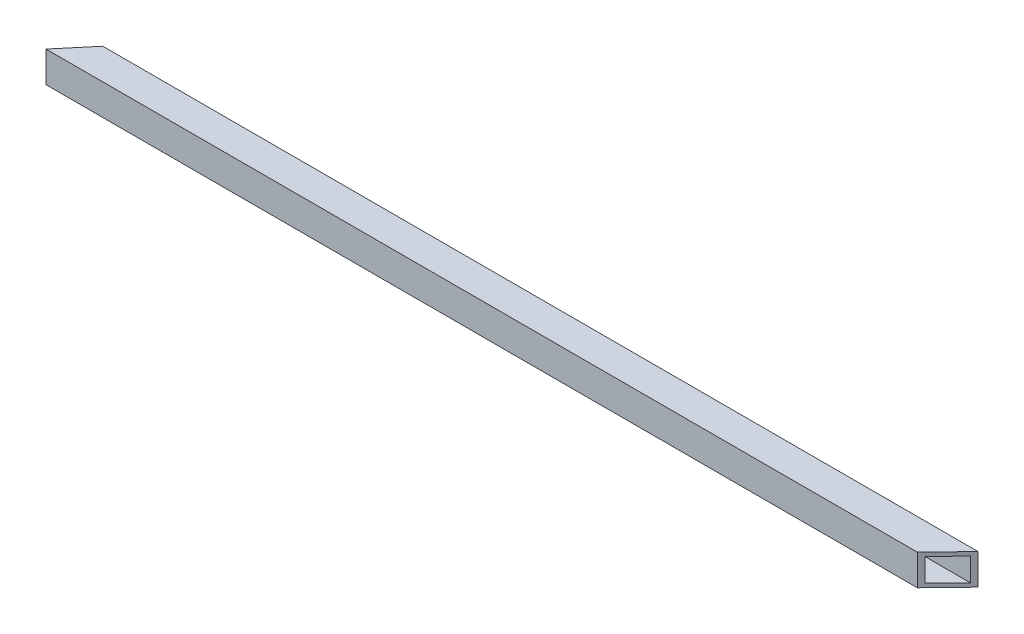
ISO-10303-21;
HEADER;
FILE_DESCRIPTION(('STEP AP214'),'2;1');
FILE_NAME('part.step','',(''),(''),'','','');
FILE_SCHEMA(('AUTOMOTIVE_DESIGN { 1 0 10303 214 1 1 1 1 }'));
ENDSEC;
DATA;
#1=APPLICATION_CONTEXT('core data for automotive mechanical design processes');
#2=APPLICATION_PROTOCOL_DEFINITION('international standard','automotive_design',2000,#1);
#3=PRODUCT_CONTEXT('',#1,'mechanical');
#4=PRODUCT('Part','Part','',(#3));
#5=PRODUCT_RELATED_PRODUCT_CATEGORY('part','',(#4));
#6=PRODUCT_DEFINITION_FORMATION('','',#4);
#7=PRODUCT_DEFINITION_CONTEXT('part definition',#1,'design');
#8=PRODUCT_DEFINITION('design','',#6,#7);
#9=PRODUCT_DEFINITION_SHAPE('','',#8);
#10=(LENGTH_UNIT() NAMED_UNIT(*) SI_UNIT(.MILLI.,.METRE.));
#11=(NAMED_UNIT(*) PLANE_ANGLE_UNIT() SI_UNIT($,.RADIAN.));
#12=(NAMED_UNIT(*) SI_UNIT($,.STERADIAN.) SOLID_ANGLE_UNIT());
#13=UNCERTAINTY_MEASURE_WITH_UNIT(LENGTH_MEASURE(1.E-05),#10,'distance_accuracy_value','');
#14=(GEOMETRIC_REPRESENTATION_CONTEXT(3) GLOBAL_UNCERTAINTY_ASSIGNED_CONTEXT((#13)) GLOBAL_UNIT_ASSIGNED_CONTEXT((#10,
#11,#12)) REPRESENTATION_CONTEXT('',''));
#15=CARTESIAN_POINT('',(0.,0.,0.));
#16=DIRECTION('',(0.,0.,1.));
#17=DIRECTION('',(1.,0.,0.));
#18=AXIS2_PLACEMENT_3D('',#15,#16,#17);
#19=CARTESIAN_POINT('',(185.42,6.35,6.35));
#20=DIRECTION('',(0.,0.,-1.));
#21=DIRECTION('',(0.,1.,0.));
#22=AXIS2_PLACEMENT_3D('',#19,#20,#21);
#23=PLANE('',#22);
#24=DIRECTION('',(-1.,0.,0.));
#25=VECTOR('',#24,1.);
#26=CARTESIAN_POINT('',(185.42,-6.35,6.35));
#27=LINE('',#26,#25);
#28=CARTESIAN_POINT('',(173.1509388256,-6.35,6.35));
#29=VERTEX_POINT('',#28);
#30=CARTESIAN_POINT('',(-185.42,-6.35,6.35));
#31=VERTEX_POINT('',#30);
#32=EDGE_CURVE('E114',#29,#31,#27,.T.);
#33=ORIENTED_EDGE('',*,*,#32,.F.);
#34=DIRECTION('',(0.,1.,0.));
#35=VECTOR('',#34,1.);
#36=CARTESIAN_POINT('',(173.1509388256,-6.35,6.35));
#37=LINE('',#36,#35);
#38=CARTESIAN_POINT('',(173.1509388256,6.35,6.35));
#39=VERTEX_POINT('',#38);
#40=EDGE_CURVE('E99',#29,#39,#37,.T.);
#41=ORIENTED_EDGE('',*,*,#40,.T.);
#42=DIRECTION('',(-1.,0.,0.));
#43=VECTOR('',#42,1.);
#44=CARTESIAN_POINT('',(185.42,6.35,6.35));
#45=LINE('',#44,#43);
#46=CARTESIAN_POINT('',(-185.42,6.35,6.35));
#47=VERTEX_POINT('',#46);
#48=EDGE_CURVE('E112',#39,#47,#45,.T.);
#49=ORIENTED_EDGE('',*,*,#48,.T.);
#50=DIRECTION('',(0.,-1.,0.));
#51=VECTOR('',#50,1.);
#52=CARTESIAN_POINT('',(-185.42,6.35,6.35));
#53=LINE('',#52,#51);
#54=EDGE_CURVE('E124',#47,#31,#53,.T.);
#55=ORIENTED_EDGE('',*,*,#54,.T.);
#56=EDGE_LOOP('',(#33,#41,#49,#55));
#57=FACE_BOUND('',#56,.T.);
#58=ADVANCED_FACE('F32',(#57),#23,.F.);
#59=CARTESIAN_POINT('',(185.42,-6.35,-6.35));
#60=DIRECTION('',(0.,1.,0.));
#61=DIRECTION('',(0.,0.,1.));
#62=AXIS2_PLACEMENT_3D('',#59,#60,#61);
#63=PLANE('',#62);
#64=DIRECTION('',(-1.,0.,0.));
#65=VECTOR('',#64,1.);
#66=CARTESIAN_POINT('',(185.42,-6.35,-6.35));
#67=LINE('',#66,#65);
#68=CARTESIAN_POINT('',(185.42,-6.35,-6.35));
#69=VERTEX_POINT('',#68);
#70=CARTESIAN_POINT('',(-174.763434684048,-6.35,-6.35));
#71=VERTEX_POINT('',#70);
#72=EDGE_CURVE('E122',#69,#71,#67,.T.);
#73=ORIENTED_EDGE('',*,*,#72,.F.);
#74=DIRECTION('',(-0.694799415327415,0.,0.719203568164593));
#75=VECTOR('',#74,1.);
#76=CARTESIAN_POINT('',(185.42,-6.35,-6.35));
#77=LINE('',#76,#75);
#78=EDGE_CURVE('E107',#69,#29,#77,.T.);
#79=ORIENTED_EDGE('',*,*,#78,.T.);
#80=ORIENTED_EDGE('',*,*,#32,.T.);
#81=DIRECTION('',(0.642787609686538,0.,-0.766044443118979));
#82=VECTOR('',#81,1.);
#83=CARTESIAN_POINT('',(-185.42,-6.35,6.35));
#84=LINE('',#83,#82);
#85=EDGE_CURVE('E162',#31,#71,#84,.T.);
#86=ORIENTED_EDGE('',*,*,#85,.T.);
#87=EDGE_LOOP('',(#73,#79,#80,#86));
#88=FACE_BOUND('',#87,.T.);
#89=ADVANCED_FACE('F172',(#88),#63,.F.);
#90=CARTESIAN_POINT('',(185.42,6.35,-6.35));
#91=DIRECTION('',(0.,0.,1.));
#92=DIRECTION('',(0.,-1.,0.));
#93=AXIS2_PLACEMENT_3D('',#90,#91,#92);
#94=PLANE('',#93);
#95=ORIENTED_EDGE('',*,*,#72,.T.);
#96=DIRECTION('',(0.,1.,0.));
#97=VECTOR('',#96,1.);
#98=CARTESIAN_POINT('',(-174.763434684048,6.34999999999996,-6.35));
#99=LINE('',#98,#97);
#100=CARTESIAN_POINT('',(-174.763434684048,6.35,-6.34999999999998));
#101=VERTEX_POINT('',#100);
#102=EDGE_CURVE('E148',#71,#101,#99,.T.);
#103=ORIENTED_EDGE('',*,*,#102,.T.);
#104=DIRECTION('',(-1.,0.,0.));
#105=VECTOR('',#104,1.);
#106=CARTESIAN_POINT('',(185.42,6.35,-6.35));
#107=LINE('',#106,#105);
#108=CARTESIAN_POINT('',(185.42,6.35,-6.35));
#109=VERTEX_POINT('',#108);
#110=EDGE_CURVE('E120',#109,#101,#107,.T.);
#111=ORIENTED_EDGE('',*,*,#110,.F.);
#112=DIRECTION('',(0.,1.,0.));
#113=VECTOR('',#112,1.);
#114=CARTESIAN_POINT('',(185.42,6.35,-6.35));
#115=LINE('',#114,#113);
#116=EDGE_CURVE('E102',#69,#109,#115,.T.);
#117=ORIENTED_EDGE('',*,*,#116,.F.);
#118=EDGE_LOOP('',(#95,#103,#111,#117));
#119=FACE_BOUND('',#118,.T.);
#120=ADVANCED_FACE('F174',(#119),#94,.F.);
#121=CARTESIAN_POINT('',(185.42,6.35,-6.35));
#122=DIRECTION('',(0.,-1.,0.));
#123=DIRECTION('',(0.,0.,-1.));
#124=AXIS2_PLACEMENT_3D('',#121,#122,#123);
#125=PLANE('',#124);
#126=ORIENTED_EDGE('',*,*,#48,.F.);
#127=DIRECTION('',(-0.694799415327415,0.,0.719203568164593));
#128=VECTOR('',#127,1.);
#129=CARTESIAN_POINT('',(185.42,6.35,-6.35));
#130=LINE('',#129,#128);
#131=EDGE_CURVE('E96',#109,#39,#130,.T.);
#132=ORIENTED_EDGE('',*,*,#131,.F.);
#133=ORIENTED_EDGE('',*,*,#110,.T.);
#134=DIRECTION('',(0.642787609686538,0.,-0.766044443118979));
#135=VECTOR('',#134,1.);
#136=CARTESIAN_POINT('',(-185.42,6.35,6.35));
#137=LINE('',#136,#135);
#138=EDGE_CURVE('E119',#47,#101,#137,.T.);
#139=ORIENTED_EDGE('',*,*,#138,.F.);
#140=EDGE_LOOP('',(#126,#132,#133,#139));
#141=FACE_BOUND('',#140,.T.);
#142=ADVANCED_FACE('F118',(#141),#125,.F.);
#143=CARTESIAN_POINT('',(185.42,4.7625,-4.7625));
#144=DIRECTION('',(0.,0.,1.));
#145=DIRECTION('',(1.,0.,0.));
#146=AXIS2_PLACEMENT_3D('',#143,#144,#145);
#147=PLANE('',#146);
#148=DIRECTION('',(0.,-1.,0.));
#149=VECTOR('',#148,1.);
#150=CARTESIAN_POINT('',(183.8863673532,4.7625,-4.7625));
#151=LINE('',#150,#149);
#152=CARTESIAN_POINT('',(183.8863673532,4.7625,-4.7625));
#153=VERTEX_POINT('',#152);
#154=CARTESIAN_POINT('',(183.8863673532,-4.7625,-4.7625));
#155=VERTEX_POINT('',#154);
#156=EDGE_CURVE('E45',#153,#155,#151,.T.);
#157=ORIENTED_EDGE('',*,*,#156,.F.);
#158=DIRECTION('',(-1.,0.,0.));
#159=VECTOR('',#158,1.);
#160=CARTESIAN_POINT('',(185.42,4.7625,-4.7625));
#161=LINE('',#160,#159);
#162=CARTESIAN_POINT('',(-176.095505348542,4.7625,-4.7625));
#163=VERTEX_POINT('',#162);
#164=EDGE_CURVE('E147',#153,#163,#161,.T.);
#165=ORIENTED_EDGE('',*,*,#164,.T.);
#166=DIRECTION('',(0.,1.,0.));
#167=VECTOR('',#166,1.);
#168=CARTESIAN_POINT('',(-176.095505348542,4.7625,-4.7625));
#169=LINE('',#168,#167);
#170=CARTESIAN_POINT('',(-176.095505348542,-4.7625,-4.7625));
#171=VERTEX_POINT('',#170);
#172=EDGE_CURVE('E138',#171,#163,#169,.T.);
#173=ORIENTED_EDGE('',*,*,#172,.F.);
#174=DIRECTION('',(-1.,0.,0.));
#175=VECTOR('',#174,1.);
#176=CARTESIAN_POINT('',(185.42,-4.7625,-4.7625));
#177=LINE('',#176,#175);
#178=EDGE_CURVE('E145',#155,#171,#177,.T.);
#179=ORIENTED_EDGE('',*,*,#178,.F.);
#180=EDGE_LOOP('',(#157,#165,#173,#179));
#181=FACE_BOUND('',#180,.T.);
#182=ADVANCED_FACE('F144',(#181),#147,.T.);
#183=CARTESIAN_POINT('',(185.42,4.7625,-4.7625));
#184=DIRECTION('',(0.,-1.,0.));
#185=DIRECTION('',(0.,0.,-1.));
#186=AXIS2_PLACEMENT_3D('',#183,#184,#185);
#187=PLANE('',#186);
#188=DIRECTION('',(0.694799415327415,0.,-0.719203568164593));
#189=VECTOR('',#188,1.);
#190=CARTESIAN_POINT('',(184.626722727874,4.7625,-5.52885963621867));
#191=LINE('',#190,#189);
#192=CARTESIAN_POINT('',(174.6845714724,4.7625,4.7625));
#193=VERTEX_POINT('',#192);
#194=EDGE_CURVE('E169',#193,#153,#191,.T.);
#195=ORIENTED_EDGE('',*,*,#194,.F.);
#196=DIRECTION('',(-1.,0.,0.));
#197=VECTOR('',#196,1.);
#198=CARTESIAN_POINT('',(185.42,4.7625,4.7625));
#199=LINE('',#198,#197);
#200=CARTESIAN_POINT('',(-184.087929335506,4.7625,4.7625));
#201=VERTEX_POINT('',#200);
#202=EDGE_CURVE('E158',#193,#201,#199,.T.);
#203=ORIENTED_EDGE('',*,*,#202,.T.);
#204=DIRECTION('',(-0.642787609686538,0.,0.766044443118979));
#205=VECTOR('',#204,1.);
#206=CARTESIAN_POINT('',(-26.7260070253288,4.7625,-182.774136250685));
#207=LINE('',#206,#205);
#208=EDGE_CURVE('E149',#163,#201,#207,.T.);
#209=ORIENTED_EDGE('',*,*,#208,.F.);
#210=ORIENTED_EDGE('',*,*,#164,.F.);
#211=EDGE_LOOP('',(#195,#203,#209,#210));
#212=FACE_BOUND('',#211,.T.);
#213=ADVANCED_FACE('F209',(#212),#187,.T.);
#214=CARTESIAN_POINT('',(185.42,4.7625,4.7625));
#215=DIRECTION('',(0.,0.,-1.));
#216=DIRECTION('',(0.,1.,0.));
#217=AXIS2_PLACEMENT_3D('',#214,#215,#216);
#218=PLANE('',#217);
#219=DIRECTION('',(0.,1.,0.));
#220=VECTOR('',#219,1.);
#221=CARTESIAN_POINT('',(174.6845714724,4.7625,4.7625));
#222=LINE('',#221,#220);
#223=CARTESIAN_POINT('',(174.6845714724,-4.7625,4.7625));
#224=VERTEX_POINT('',#223);
#225=EDGE_CURVE('E115',#224,#193,#222,.T.);
#226=ORIENTED_EDGE('',*,*,#225,.F.);
#227=DIRECTION('',(-1.,0.,0.));
#228=VECTOR('',#227,1.);
#229=CARTESIAN_POINT('',(185.42,-4.7625,4.7625));
#230=LINE('',#229,#228);
#231=CARTESIAN_POINT('',(-184.087929335506,-4.7625,4.7625));
#232=VERTEX_POINT('',#231);
#233=EDGE_CURVE('E53',#224,#232,#230,.T.);
#234=ORIENTED_EDGE('',*,*,#233,.T.);
#235=DIRECTION('',(0.,-1.,0.));
#236=VECTOR('',#235,1.);
#237=CARTESIAN_POINT('',(-184.087929335506,4.76250000000003,4.7625));
#238=LINE('',#237,#236);
#239=EDGE_CURVE('E140',#201,#232,#238,.T.);
#240=ORIENTED_EDGE('',*,*,#239,.F.);
#241=ORIENTED_EDGE('',*,*,#202,.F.);
#242=EDGE_LOOP('',(#226,#234,#240,#241));
#243=FACE_BOUND('',#242,.T.);
#244=ADVANCED_FACE('F218',(#243),#218,.T.);
#245=CARTESIAN_POINT('',(185.42,-4.7625,-4.7625));
#246=DIRECTION('',(0.,1.,0.));
#247=DIRECTION('',(0.,0.,1.));
#248=AXIS2_PLACEMENT_3D('',#245,#246,#247);
#249=PLANE('',#248);
#250=DIRECTION('',(-0.694799415327415,0.,0.719203568164593));
#251=VECTOR('',#250,1.);
#252=CARTESIAN_POINT('',(184.626722727874,-4.7625,-5.52885963621867));
#253=LINE('',#252,#251);
#254=EDGE_CURVE('E11',#155,#224,#253,.T.);
#255=ORIENTED_EDGE('',*,*,#254,.F.);
#256=ORIENTED_EDGE('',*,*,#178,.T.);
#257=DIRECTION('',(0.642787609686538,0.,-0.766044443118979));
#258=VECTOR('',#257,1.);
#259=CARTESIAN_POINT('',(-26.7260070253288,-4.76250000000002,-182.774136250685));
#260=LINE('',#259,#258);
#261=EDGE_CURVE('E39',#232,#171,#260,.T.);
#262=ORIENTED_EDGE('',*,*,#261,.F.);
#263=ORIENTED_EDGE('',*,*,#233,.F.);
#264=EDGE_LOOP('',(#255,#256,#262,#263));
#265=FACE_BOUND('',#264,.T.);
#266=ADVANCED_FACE('F228',(#265),#249,.T.);
#267=CARTESIAN_POINT('',(-185.42,-6.35,6.35));
#268=DIRECTION('',(0.766044443118979,0.,0.642787609686538));
#269=DIRECTION('',(0.642787609686538,0.,-0.766044443118979));
#270=AXIS2_PLACEMENT_3D('',#267,#268,#269);
#271=PLANE('',#270);
#272=ORIENTED_EDGE('',*,*,#172,.T.);
#273=ORIENTED_EDGE('',*,*,#208,.T.);
#274=ORIENTED_EDGE('',*,*,#239,.T.);
#275=ORIENTED_EDGE('',*,*,#261,.T.);
#276=EDGE_LOOP('',(#272,#273,#274,#275));
#277=FACE_BOUND('',#276,.T.);
#278=ORIENTED_EDGE('',*,*,#85,.F.);
#279=ORIENTED_EDGE('',*,*,#54,.F.);
#280=ORIENTED_EDGE('',*,*,#138,.T.);
#281=ORIENTED_EDGE('',*,*,#102,.F.);
#282=EDGE_LOOP('',(#278,#279,#280,#281));
#283=FACE_BOUND('',#282,.T.);
#284=ADVANCED_FACE('F135',(#277,#283),#271,.F.);
#285=CARTESIAN_POINT('',(185.42,-6.35,-6.35));
#286=DIRECTION('',(-0.719203568164593,0.,-0.694799415327415));
#287=DIRECTION('',(-0.694799415327415,0.,0.719203568164593));
#288=AXIS2_PLACEMENT_3D('',#285,#286,#287);
#289=PLANE('',#288);
#290=ORIENTED_EDGE('',*,*,#156,.T.);
#291=ORIENTED_EDGE('',*,*,#254,.T.);
#292=ORIENTED_EDGE('',*,*,#225,.T.);
#293=ORIENTED_EDGE('',*,*,#194,.T.);
#294=EDGE_LOOP('',(#290,#291,#292,#293));
#295=FACE_BOUND('',#294,.T.);
#296=ORIENTED_EDGE('',*,*,#40,.F.);
#297=ORIENTED_EDGE('',*,*,#78,.F.);
#298=ORIENTED_EDGE('',*,*,#116,.T.);
#299=ORIENTED_EDGE('',*,*,#131,.T.);
#300=EDGE_LOOP('',(#296,#297,#298,#299));
#301=FACE_BOUND('',#300,.T.);
#302=ADVANCED_FACE('F98',(#295,#301),#289,.F.);
#303=CLOSED_SHELL('',(#58,#89,#120,#142,#182,#213,#244,#266,#284,#302));
#304=MANIFOLD_SOLID_BREP('B2',#303);
#305=ADVANCED_BREP_SHAPE_REPRESENTATION('',(#18,#304),#14);
#306=SHAPE_DEFINITION_REPRESENTATION(#9,#305);
ENDSEC;
END-ISO-10303-21;
